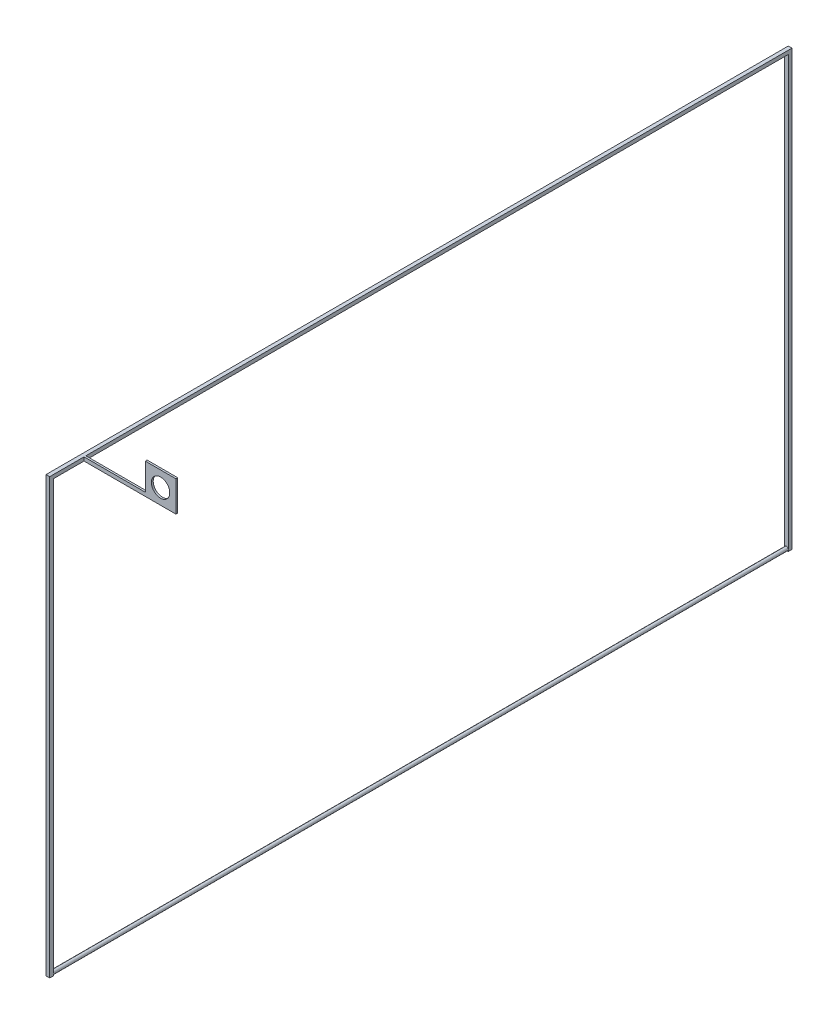
ISO-10303-21;
HEADER;
FILE_DESCRIPTION(('STEP AP214'),'2;1');
FILE_NAME('part.step','',(''),(''),'','','');
FILE_SCHEMA(('AUTOMOTIVE_DESIGN { 1 0 10303 214 1 1 1 1 }'));
ENDSEC;
DATA;
#1=APPLICATION_CONTEXT('core data for automotive mechanical design processes');
#2=APPLICATION_PROTOCOL_DEFINITION('international standard','automotive_design',2000,#1);
#3=PRODUCT_CONTEXT('',#1,'mechanical');
#4=PRODUCT('Part','Part','',(#3));
#5=PRODUCT_RELATED_PRODUCT_CATEGORY('part','',(#4));
#6=PRODUCT_DEFINITION_FORMATION('','',#4);
#7=PRODUCT_DEFINITION_CONTEXT('part definition',#1,'design');
#8=PRODUCT_DEFINITION('design','',#6,#7);
#9=PRODUCT_DEFINITION_SHAPE('','',#8);
#10=(LENGTH_UNIT() NAMED_UNIT(*) SI_UNIT(.MILLI.,.METRE.));
#11=(NAMED_UNIT(*) PLANE_ANGLE_UNIT() SI_UNIT($,.RADIAN.));
#12=(NAMED_UNIT(*) SI_UNIT($,.STERADIAN.) SOLID_ANGLE_UNIT());
#13=UNCERTAINTY_MEASURE_WITH_UNIT(LENGTH_MEASURE(1.E-05),#10,'distance_accuracy_value','');
#14=(GEOMETRIC_REPRESENTATION_CONTEXT(3) GLOBAL_UNCERTAINTY_ASSIGNED_CONTEXT((#13)) GLOBAL_UNIT_ASSIGNED_CONTEXT((#10,
#11,#12)) REPRESENTATION_CONTEXT('',''));
#15=CARTESIAN_POINT('',(0.,0.,0.));
#16=DIRECTION('',(0.,0.,1.));
#17=DIRECTION('',(1.,0.,0.));
#18=AXIS2_PLACEMENT_3D('',#15,#16,#17);
#19=CARTESIAN_POINT('',(1.5,-1.5,0.));
#20=DIRECTION('',(-1.,0.,0.));
#21=DIRECTION('',(0.,0.,1.));
#22=AXIS2_PLACEMENT_3D('',#19,#20,#21);
#23=PLANE('',#22);
#24=DIRECTION('',(0.,1.,0.));
#25=VECTOR('',#24,1.);
#26=CARTESIAN_POINT('',(1.5,196.831928314114,-25.0000000000018));
#27=LINE('',#26,#25);
#28=CARTESIAN_POINT('',(1.5,350.,-25.0000000000032));
#29=VERTEX_POINT('',#28);
#30=CARTESIAN_POINT('',(1.5,353.,-25.0000000000032));
#31=VERTEX_POINT('',#30);
#32=EDGE_CURVE('E52',#29,#31,#27,.T.);
#33=ORIENTED_EDGE('',*,*,#32,.T.);
#34=DIRECTION('',(0.,0.,1.));
#35=VECTOR('',#34,1.);
#36=CARTESIAN_POINT('',(1.5,353.,2.99999999999994));
#37=LINE('',#36,#35);
#38=CARTESIAN_POINT('',(1.5,353.,2.99999999999994));
#39=VERTEX_POINT('',#38);
#40=EDGE_CURVE('E229',#31,#39,#37,.T.);
#41=ORIENTED_EDGE('',*,*,#40,.T.);
#42=DIRECTION('',(0.,-1.,0.));
#43=VECTOR('',#42,1.);
#44=CARTESIAN_POINT('',(1.5,-1.50000000000002,2.99999999999993));
#45=LINE('',#44,#43);
#46=CARTESIAN_POINT('',(1.5,-1.50000000000002,2.99999999999993));
#47=VERTEX_POINT('',#46);
#48=EDGE_CURVE('E231',#39,#47,#45,.T.);
#49=ORIENTED_EDGE('',*,*,#48,.T.);
#50=DIRECTION('',(0.,0.,-1.));
#51=VECTOR('',#50,1.);
#52=CARTESIAN_POINT('',(1.5,-1.5,0.));
#53=LINE('',#52,#51);
#54=CARTESIAN_POINT('',(1.5,-1.5,0.));
#55=VERTEX_POINT('',#54);
#56=EDGE_CURVE('E234',#47,#55,#53,.T.);
#57=ORIENTED_EDGE('',*,*,#56,.T.);
#58=DIRECTION('',(0.,1.,0.));
#59=VECTOR('',#58,1.);
#60=CARTESIAN_POINT('',(1.5,350.,0.));
#61=LINE('',#60,#59);
#62=CARTESIAN_POINT('',(1.5,0.,0.));
#63=VERTEX_POINT('',#62);
#64=EDGE_CURVE('E216',#55,#63,#61,.T.);
#65=ORIENTED_EDGE('',*,*,#64,.T.);
#66=CARTESIAN_POINT('',(1.5,350.,0.));
#67=VERTEX_POINT('',#66);
#68=EDGE_CURVE('E167',#63,#67,#61,.T.);
#69=ORIENTED_EDGE('',*,*,#68,.T.);
#70=DIRECTION('',(0.,0.,-1.));
#71=VECTOR('',#70,1.);
#72=CARTESIAN_POINT('',(1.5,350.,0.));
#73=LINE('',#72,#71);
#74=EDGE_CURVE('E218',#67,#29,#73,.T.);
#75=ORIENTED_EDGE('',*,*,#74,.T.);
#76=EDGE_LOOP('',(#33,#41,#49,#57,#65,#69,#75));
#77=FACE_BOUND('',#76,.T.);
#78=ADVANCED_FACE('F35',(#77),#23,.F.);
#79=CARTESIAN_POINT('',(-1.5,0.,0.));
#80=DIRECTION('',(0.,0.,-1.));
#81=DIRECTION('',(0.,1.,0.));
#82=AXIS2_PLACEMENT_3D('',#79,#80,#81);
#83=PLANE('',#82);
#84=DIRECTION('',(0.,1.,0.));
#85=VECTOR('',#84,1.);
#86=CARTESIAN_POINT('',(-1.5,350.,0.));
#87=LINE('',#86,#85);
#88=CARTESIAN_POINT('',(-1.5,-1.5,0.));
#89=VERTEX_POINT('',#88);
#90=CARTESIAN_POINT('',(-1.5,0.,0.));
#91=VERTEX_POINT('',#90);
#92=EDGE_CURVE('E238',#89,#91,#87,.T.);
#93=ORIENTED_EDGE('',*,*,#92,.T.);
#94=CARTESIAN_POINT('',(0.,0.,0.));
#95=DIRECTION('',(0.,0.,-1.));
#96=DIRECTION('',(-1.,0.,0.));
#97=AXIS2_PLACEMENT_3D('',#94,#95,#96);
#98=CIRCLE('',#97,1.5);
#99=CARTESIAN_POINT('',(0.,-1.5,0.));
#100=VERTEX_POINT('',#99);
#101=EDGE_CURVE('E45',#100,#91,#98,.T.);
#102=ORIENTED_EDGE('',*,*,#101,.F.);
#103=DIRECTION('',(1.,0.,0.));
#104=VECTOR('',#103,1.);
#105=CARTESIAN_POINT('',(-1.5,-1.5,0.));
#106=LINE('',#105,#104);
#107=EDGE_CURVE('E264',#89,#100,#106,.T.);
#108=ORIENTED_EDGE('',*,*,#107,.F.);
#109=EDGE_LOOP('',(#93,#102,#108));
#110=FACE_BOUND('',#109,.T.);
#111=ADVANCED_FACE('F341',(#110),#83,.T.);
#112=EDGE_CURVE('E268',#100,#55,#106,.T.);
#113=ORIENTED_EDGE('',*,*,#112,.F.);
#114=EDGE_CURVE('E44',#63,#100,#98,.T.);
#115=ORIENTED_EDGE('',*,*,#114,.F.);
#116=ORIENTED_EDGE('',*,*,#64,.F.);
#117=EDGE_LOOP('',(#113,#115,#116));
#118=FACE_BOUND('',#117,.T.);
#119=ADVANCED_FACE('F348',(#118),#83,.T.);
#120=CARTESIAN_POINT('',(-1.5,-1.49999999999995,-600.));
#121=DIRECTION('',(0.,0.,1.));
#122=DIRECTION('',(1.,0.,0.));
#123=AXIS2_PLACEMENT_3D('',#120,#121,#122);
#124=PLANE('',#123);
#125=DIRECTION('',(0.,-1.,0.));
#126=VECTOR('',#125,1.);
#127=CARTESIAN_POINT('',(1.5,350.,-600.));
#128=LINE('',#127,#126);
#129=CARTESIAN_POINT('',(1.5,0.,-600.));
#130=VERTEX_POINT('',#129);
#131=CARTESIAN_POINT('',(1.5,-1.49999999999995,-600.));
#132=VERTEX_POINT('',#131);
#133=EDGE_CURVE('E220',#130,#132,#128,.T.);
#134=ORIENTED_EDGE('',*,*,#133,.F.);
#135=CARTESIAN_POINT('',(0.,0.,-600.));
#136=DIRECTION('',(0.,0.,-1.));
#137=DIRECTION('',(-1.,0.,0.));
#138=AXIS2_PLACEMENT_3D('',#135,#136,#137);
#139=CIRCLE('',#138,1.5);
#140=CARTESIAN_POINT('',(0.,-1.49999999999995,-600.));
#141=VERTEX_POINT('',#140);
#142=EDGE_CURVE('E329',#130,#141,#139,.T.);
#143=ORIENTED_EDGE('',*,*,#142,.T.);
#144=DIRECTION('',(1.,0.,0.));
#145=VECTOR('',#144,1.);
#146=CARTESIAN_POINT('',(-1.5,-1.49999999999995,-600.));
#147=LINE('',#146,#145);
#148=EDGE_CURVE('E281',#141,#132,#147,.T.);
#149=ORIENTED_EDGE('',*,*,#148,.T.);
#150=EDGE_LOOP('',(#134,#143,#149));
#151=FACE_BOUND('',#150,.T.);
#152=ADVANCED_FACE('F328',(#151),#124,.T.);
#153=CARTESIAN_POINT('',(-1.5,-1.49999999999995,-600.));
#154=VERTEX_POINT('',#153);
#155=EDGE_CURVE('E278',#154,#141,#147,.T.);
#156=ORIENTED_EDGE('',*,*,#155,.T.);
#157=CARTESIAN_POINT('',(-1.5,0.,-600.));
#158=VERTEX_POINT('',#157);
#159=EDGE_CURVE('E267',#141,#158,#139,.T.);
#160=ORIENTED_EDGE('',*,*,#159,.T.);
#161=DIRECTION('',(0.,-1.,0.));
#162=VECTOR('',#161,1.);
#163=CARTESIAN_POINT('',(-1.5,350.,-600.));
#164=LINE('',#163,#162);
#165=EDGE_CURVE('E244',#158,#154,#164,.T.);
#166=ORIENTED_EDGE('',*,*,#165,.T.);
#167=EDGE_LOOP('',(#156,#160,#166));
#168=FACE_BOUND('',#167,.T.);
#169=ADVANCED_FACE('F332',(#168),#124,.T.);
#170=ORIENTED_EDGE('',*,*,#68,.F.);
#171=EDGE_CURVE('E11',#91,#63,#98,.T.);
#172=ORIENTED_EDGE('',*,*,#171,.F.);
#173=CARTESIAN_POINT('',(-1.5,350.,0.));
#174=VERTEX_POINT('',#173);
#175=EDGE_CURVE('E237',#91,#174,#87,.T.);
#176=ORIENTED_EDGE('',*,*,#175,.T.);
#177=DIRECTION('',(1.,0.,0.));
#178=VECTOR('',#177,1.);
#179=CARTESIAN_POINT('',(-1.5,350.,0.));
#180=LINE('',#179,#178);
#181=EDGE_CURVE('E263',#174,#67,#180,.T.);
#182=ORIENTED_EDGE('',*,*,#181,.T.);
#183=EDGE_LOOP('',(#170,#172,#176,#182));
#184=FACE_BOUND('',#183,.T.);
#185=ADVANCED_FACE('F289',(#184),#83,.T.);
#186=CARTESIAN_POINT('',(-1.5,-1.5,0.));
#187=DIRECTION('',(0.,-1.,0.));
#188=DIRECTION('',(0.,0.,-1.));
#189=AXIS2_PLACEMENT_3D('',#186,#187,#188);
#190=PLANE('',#189);
#191=ORIENTED_EDGE('',*,*,#107,.T.);
#192=ORIENTED_EDGE('',*,*,#112,.T.);
#193=ORIENTED_EDGE('',*,*,#56,.F.);
#194=DIRECTION('',(1.,0.,0.));
#195=VECTOR('',#194,1.);
#196=CARTESIAN_POINT('',(-1.5,-1.50000000000002,2.99999999999993));
#197=LINE('',#196,#195);
#198=CARTESIAN_POINT('',(-1.5,-1.50000000000002,2.99999999999993));
#199=VERTEX_POINT('',#198);
#200=EDGE_CURVE('E269',#199,#47,#197,.T.);
#201=ORIENTED_EDGE('',*,*,#200,.F.);
#202=DIRECTION('',(0.,0.,-1.));
#203=VECTOR('',#202,1.);
#204=CARTESIAN_POINT('',(-1.5,-1.5,0.));
#205=LINE('',#204,#203);
#206=EDGE_CURVE('E260',#199,#89,#205,.T.);
#207=ORIENTED_EDGE('',*,*,#206,.T.);
#208=EDGE_LOOP('',(#191,#192,#193,#201,#207));
#209=FACE_BOUND('',#208,.T.);
#210=ADVANCED_FACE('F351',(#209),#190,.T.);
#211=CARTESIAN_POINT('',(-1.5,-1.50000000000002,2.99999999999993));
#212=DIRECTION('',(0.,0.,1.));
#213=DIRECTION('',(0.,-1.,0.));
#214=AXIS2_PLACEMENT_3D('',#211,#212,#213);
#215=PLANE('',#214);
#216=ORIENTED_EDGE('',*,*,#200,.T.);
#217=ORIENTED_EDGE('',*,*,#48,.F.);
#218=DIRECTION('',(1.,0.,0.));
#219=VECTOR('',#218,1.);
#220=CARTESIAN_POINT('',(-1.5,353.,2.99999999999994));
#221=LINE('',#220,#219);
#222=CARTESIAN_POINT('',(-1.5,353.,2.99999999999994));
#223=VERTEX_POINT('',#222);
#224=EDGE_CURVE('E271',#223,#39,#221,.T.);
#225=ORIENTED_EDGE('',*,*,#224,.F.);
#226=DIRECTION('',(0.,-1.,0.));
#227=VECTOR('',#226,1.);
#228=CARTESIAN_POINT('',(-1.5,-1.50000000000002,2.99999999999993));
#229=LINE('',#228,#227);
#230=EDGE_CURVE('E257',#223,#199,#229,.T.);
#231=ORIENTED_EDGE('',*,*,#230,.T.);
#232=EDGE_LOOP('',(#216,#217,#225,#231));
#233=FACE_BOUND('',#232,.T.);
#234=ADVANCED_FACE('F353',(#233),#215,.T.);
#235=CARTESIAN_POINT('',(-1.5,353.,2.99999999999994));
#236=DIRECTION('',(0.,1.,0.));
#237=DIRECTION('',(0.,0.,1.));
#238=AXIS2_PLACEMENT_3D('',#235,#236,#237);
#239=PLANE('',#238);
#240=ORIENTED_EDGE('',*,*,#224,.T.);
#241=ORIENTED_EDGE('',*,*,#40,.F.);
#242=DIRECTION('',(1.,0.,0.));
#243=VECTOR('',#242,1.);
#244=CARTESIAN_POINT('',(-303.369413495186,353.,-25.0000000000033));
#245=LINE('',#244,#243);
#246=CARTESIAN_POINT('',(51.5,353.,-25.0000000000033));
#247=VERTEX_POINT('',#246);
#248=EDGE_CURVE('E201',#31,#247,#245,.T.);
#249=ORIENTED_EDGE('',*,*,#248,.T.);
#250=DIRECTION('',(0.,0.,1.));
#251=VECTOR('',#250,1.);
#252=CARTESIAN_POINT('',(51.5,353.,-26.5000000000033));
#253=LINE('',#252,#251);
#254=CARTESIAN_POINT('',(51.5,353.,-26.5000000000033));
#255=VERTEX_POINT('',#254);
#256=EDGE_CURVE('E168',#255,#247,#253,.T.);
#257=ORIENTED_EDGE('',*,*,#256,.F.);
#258=DIRECTION('',(1.,0.,0.));
#259=VECTOR('',#258,1.);
#260=CARTESIAN_POINT('',(-303.369413495186,353.,-26.5000000000033));
#261=LINE('',#260,#259);
#262=CARTESIAN_POINT('',(1.5,353.,-26.5000000000033));
#263=VERTEX_POINT('',#262);
#264=EDGE_CURVE('E186',#263,#255,#261,.T.);
#265=ORIENTED_EDGE('',*,*,#264,.F.);
#266=CARTESIAN_POINT('',(1.5,353.,-603.));
#267=VERTEX_POINT('',#266);
#268=EDGE_CURVE('E60',#267,#263,#37,.T.);
#269=ORIENTED_EDGE('',*,*,#268,.F.);
#270=DIRECTION('',(1.,0.,0.));
#271=VECTOR('',#270,1.);
#272=CARTESIAN_POINT('',(-1.5,353.,-603.));
#273=LINE('',#272,#271);
#274=CARTESIAN_POINT('',(-1.5,353.,-603.));
#275=VERTEX_POINT('',#274);
#276=EDGE_CURVE('E274',#275,#267,#273,.T.);
#277=ORIENTED_EDGE('',*,*,#276,.F.);
#278=DIRECTION('',(0.,0.,1.));
#279=VECTOR('',#278,1.);
#280=CARTESIAN_POINT('',(-1.5,353.,2.99999999999994));
#281=LINE('',#280,#279);
#282=EDGE_CURVE('E254',#275,#223,#281,.T.);
#283=ORIENTED_EDGE('',*,*,#282,.T.);
#284=EDGE_LOOP('',(#240,#241,#249,#257,#265,#269,#277,#283));
#285=FACE_BOUND('',#284,.T.);
#286=ADVANCED_FACE('F301',(#285),#239,.T.);
#287=CARTESIAN_POINT('',(-1.5,353.,-603.));
#288=DIRECTION('',(0.,0.,-1.));
#289=DIRECTION('',(0.,1.,0.));
#290=AXIS2_PLACEMENT_3D('',#287,#288,#289);
#291=PLANE('',#290);
#292=ORIENTED_EDGE('',*,*,#276,.T.);
#293=DIRECTION('',(0.,1.,0.));
#294=VECTOR('',#293,1.);
#295=CARTESIAN_POINT('',(1.5,353.,-603.));
#296=LINE('',#295,#294);
#297=CARTESIAN_POINT('',(1.5,-1.49999999999995,-603.));
#298=VERTEX_POINT('',#297);
#299=EDGE_CURVE('E227',#298,#267,#296,.T.);
#300=ORIENTED_EDGE('',*,*,#299,.F.);
#301=DIRECTION('',(1.,0.,0.));
#302=VECTOR('',#301,1.);
#303=CARTESIAN_POINT('',(-1.5,-1.49999999999995,-603.));
#304=LINE('',#303,#302);
#305=CARTESIAN_POINT('',(-1.5,-1.49999999999995,-603.));
#306=VERTEX_POINT('',#305);
#307=EDGE_CURVE('E276',#306,#298,#304,.T.);
#308=ORIENTED_EDGE('',*,*,#307,.F.);
#309=DIRECTION('',(0.,1.,0.));
#310=VECTOR('',#309,1.);
#311=CARTESIAN_POINT('',(-1.5,353.,-603.));
#312=LINE('',#311,#310);
#313=EDGE_CURVE('E251',#306,#275,#312,.T.);
#314=ORIENTED_EDGE('',*,*,#313,.T.);
#315=EDGE_LOOP('',(#292,#300,#308,#314));
#316=FACE_BOUND('',#315,.T.);
#317=ADVANCED_FACE('F316',(#316),#291,.T.);
#318=CARTESIAN_POINT('',(-1.5,-1.49999999999995,-603.));
#319=DIRECTION('',(0.,-1.,0.));
#320=DIRECTION('',(0.,0.,-1.));
#321=AXIS2_PLACEMENT_3D('',#318,#319,#320);
#322=PLANE('',#321);
#323=ORIENTED_EDGE('',*,*,#307,.T.);
#324=DIRECTION('',(0.,0.,-1.));
#325=VECTOR('',#324,1.);
#326=CARTESIAN_POINT('',(1.5,-1.49999999999995,-603.));
#327=LINE('',#326,#325);
#328=EDGE_CURVE('E224',#132,#298,#327,.T.);
#329=ORIENTED_EDGE('',*,*,#328,.F.);
#330=ORIENTED_EDGE('',*,*,#148,.F.);
#331=ORIENTED_EDGE('',*,*,#155,.F.);
#332=DIRECTION('',(0.,0.,-1.));
#333=VECTOR('',#332,1.);
#334=CARTESIAN_POINT('',(-1.5,-1.49999999999995,-603.));
#335=LINE('',#334,#333);
#336=EDGE_CURVE('E248',#154,#306,#335,.T.);
#337=ORIENTED_EDGE('',*,*,#336,.T.);
#338=EDGE_LOOP('',(#323,#329,#330,#331,#337));
#339=FACE_BOUND('',#338,.T.);
#340=ADVANCED_FACE('F319',(#339),#322,.T.);
#341=CARTESIAN_POINT('',(-1.5,350.,-600.));
#342=VERTEX_POINT('',#341);
#343=EDGE_CURVE('E245',#342,#158,#164,.T.);
#344=ORIENTED_EDGE('',*,*,#343,.T.);
#345=EDGE_CURVE('E39',#158,#130,#139,.T.);
#346=ORIENTED_EDGE('',*,*,#345,.T.);
#347=CARTESIAN_POINT('',(1.5,350.,-600.));
#348=VERTEX_POINT('',#347);
#349=EDGE_CURVE('E221',#348,#130,#128,.T.);
#350=ORIENTED_EDGE('',*,*,#349,.F.);
#351=DIRECTION('',(1.,0.,0.));
#352=VECTOR('',#351,1.);
#353=CARTESIAN_POINT('',(-1.5,350.,-600.));
#354=LINE('',#353,#352);
#355=EDGE_CURVE('E282',#342,#348,#354,.T.);
#356=ORIENTED_EDGE('',*,*,#355,.F.);
#357=EDGE_LOOP('',(#344,#346,#350,#356));
#358=FACE_BOUND('',#357,.T.);
#359=ADVANCED_FACE('F337',(#358),#124,.T.);
#360=CARTESIAN_POINT('',(-1.5,350.,0.));
#361=DIRECTION('',(0.,-1.,0.));
#362=DIRECTION('',(0.,0.,-1.));
#363=AXIS2_PLACEMENT_3D('',#360,#361,#362);
#364=PLANE('',#363);
#365=ORIENTED_EDGE('',*,*,#355,.T.);
#366=CARTESIAN_POINT('',(1.5,350.,-26.5000000000033));
#367=VERTEX_POINT('',#366);
#368=EDGE_CURVE('E183',#367,#348,#73,.T.);
#369=ORIENTED_EDGE('',*,*,#368,.F.);
#370=DIRECTION('',(1.,0.,0.));
#371=VECTOR('',#370,1.);
#372=CARTESIAN_POINT('',(-303.369413495186,350.,-26.5000000000032));
#373=LINE('',#372,#371);
#374=CARTESIAN_POINT('',(76.4999999999999,350.,-26.5000000000032));
#375=VERTEX_POINT('',#374);
#376=EDGE_CURVE('E174',#367,#375,#373,.T.);
#377=ORIENTED_EDGE('',*,*,#376,.T.);
#378=DIRECTION('',(0.,0.,1.));
#379=VECTOR('',#378,1.);
#380=CARTESIAN_POINT('',(76.4999999999999,350.,-26.5000000000032));
#381=LINE('',#380,#379);
#382=CARTESIAN_POINT('',(76.4999999999999,350.,-25.0000000000032));
#383=VERTEX_POINT('',#382);
#384=EDGE_CURVE('E157',#375,#383,#381,.T.);
#385=ORIENTED_EDGE('',*,*,#384,.T.);
#386=DIRECTION('',(1.,0.,0.));
#387=VECTOR('',#386,1.);
#388=CARTESIAN_POINT('',(-303.369413495186,350.,-25.0000000000032));
#389=LINE('',#388,#387);
#390=EDGE_CURVE('E198',#29,#383,#389,.T.);
#391=ORIENTED_EDGE('',*,*,#390,.F.);
#392=ORIENTED_EDGE('',*,*,#74,.F.);
#393=ORIENTED_EDGE('',*,*,#181,.F.);
#394=DIRECTION('',(0.,0.,-1.));
#395=VECTOR('',#394,1.);
#396=CARTESIAN_POINT('',(-1.5,350.,0.));
#397=LINE('',#396,#395);
#398=EDGE_CURVE('E241',#174,#342,#397,.T.);
#399=ORIENTED_EDGE('',*,*,#398,.T.);
#400=EDGE_LOOP('',(#365,#369,#377,#385,#391,#392,#393,#399));
#401=FACE_BOUND('',#400,.T.);
#402=ADVANCED_FACE('F182',(#401),#364,.T.);
#403=CARTESIAN_POINT('',(-1.5,-1.5,0.));
#404=DIRECTION('',(-1.,0.,0.));
#405=DIRECTION('',(0.,0.,1.));
#406=AXIS2_PLACEMENT_3D('',#403,#404,#405);
#407=PLANE('',#406);
#408=ORIENTED_EDGE('',*,*,#92,.F.);
#409=ORIENTED_EDGE('',*,*,#206,.F.);
#410=ORIENTED_EDGE('',*,*,#230,.F.);
#411=ORIENTED_EDGE('',*,*,#282,.F.);
#412=ORIENTED_EDGE('',*,*,#313,.F.);
#413=ORIENTED_EDGE('',*,*,#336,.F.);
#414=ORIENTED_EDGE('',*,*,#165,.F.);
#415=ORIENTED_EDGE('',*,*,#343,.F.);
#416=ORIENTED_EDGE('',*,*,#398,.F.);
#417=ORIENTED_EDGE('',*,*,#175,.F.);
#418=EDGE_LOOP('',(#408,#409,#410,#411,#412,#413,#414,#415,#416,#417));
#419=FACE_BOUND('',#418,.T.);
#420=ADVANCED_FACE('F313',(#419),#407,.T.);
#421=ORIENTED_EDGE('',*,*,#268,.T.);
#422=DIRECTION('',(0.,1.,0.));
#423=VECTOR('',#422,1.);
#424=CARTESIAN_POINT('',(1.5,196.831928314114,-26.5000000000018));
#425=LINE('',#424,#423);
#426=EDGE_CURVE('E184',#367,#263,#425,.T.);
#427=ORIENTED_EDGE('',*,*,#426,.F.);
#428=ORIENTED_EDGE('',*,*,#368,.T.);
#429=ORIENTED_EDGE('',*,*,#349,.T.);
#430=ORIENTED_EDGE('',*,*,#133,.T.);
#431=ORIENTED_EDGE('',*,*,#328,.T.);
#432=ORIENTED_EDGE('',*,*,#299,.T.);
#433=EDGE_LOOP('',(#421,#427,#428,#429,#430,#431,#432));
#434=FACE_BOUND('',#433,.T.);
#435=ADVANCED_FACE('F323',(#434),#23,.F.);
#436=CARTESIAN_POINT('',(0.,0.,0.));
#437=DIRECTION('',(0.,0.,-1.));
#438=DIRECTION('',(-1.,0.,0.));
#439=AXIS2_PLACEMENT_3D('',#436,#437,#438);
#440=CYLINDRICAL_SURFACE('',#439,1.5);
#441=ORIENTED_EDGE('',*,*,#171,.T.);
#442=ORIENTED_EDGE('',*,*,#114,.T.);
#443=ORIENTED_EDGE('',*,*,#101,.T.);
#444=EDGE_LOOP('',(#441,#442,#443));
#445=FACE_BOUND('',#444,.T.);
#446=ORIENTED_EDGE('',*,*,#345,.F.);
#447=ORIENTED_EDGE('',*,*,#159,.F.);
#448=ORIENTED_EDGE('',*,*,#142,.F.);
#449=EDGE_LOOP('',(#446,#447,#448));
#450=FACE_BOUND('',#449,.T.);
#451=ADVANCED_FACE('F37',(#445,#450),#440,.T.);
#452=CARTESIAN_POINT('',(76.4999999999999,196.831928314114,-26.5000000000018));
#453=DIRECTION('',(1.,0.,0.));
#454=DIRECTION('',(0.,1.,0.));
#455=AXIS2_PLACEMENT_3D('',#452,#453,#454);
#456=PLANE('',#455);
#457=DIRECTION('',(0.,1.,0.));
#458=VECTOR('',#457,1.);
#459=CARTESIAN_POINT('',(76.4999999999999,196.831928314114,-25.0000000000018));
#460=LINE('',#459,#458);
#461=CARTESIAN_POINT('',(76.5000000000001,375.,-25.0000000000035));
#462=VERTEX_POINT('',#461);
#463=EDGE_CURVE('E162',#383,#462,#460,.T.);
#464=ORIENTED_EDGE('',*,*,#463,.F.);
#465=ORIENTED_EDGE('',*,*,#384,.F.);
#466=DIRECTION('',(0.,1.,0.));
#467=VECTOR('',#466,1.);
#468=CARTESIAN_POINT('',(76.4999999999999,196.831928314114,-26.5000000000018));
#469=LINE('',#468,#467);
#470=CARTESIAN_POINT('',(76.5000000000001,375.,-26.5000000000035));
#471=VERTEX_POINT('',#470);
#472=EDGE_CURVE('E160',#375,#471,#469,.T.);
#473=ORIENTED_EDGE('',*,*,#472,.T.);
#474=DIRECTION('',(0.,0.,1.));
#475=VECTOR('',#474,1.);
#476=CARTESIAN_POINT('',(76.5000000000001,375.,-26.5000000000035));
#477=LINE('',#476,#475);
#478=EDGE_CURVE('E196',#471,#462,#477,.T.);
#479=ORIENTED_EDGE('',*,*,#478,.T.);
#480=EDGE_LOOP('',(#464,#465,#473,#479));
#481=FACE_BOUND('',#480,.T.);
#482=ADVANCED_FACE('F159',(#481),#456,.T.);
#483=CARTESIAN_POINT('',(51.5,196.831928314114,-26.5000000000018));
#484=DIRECTION('',(1.,0.,0.));
#485=DIRECTION('',(0.,0.,-1.));
#486=AXIS2_PLACEMENT_3D('',#483,#484,#485);
#487=PLANE('',#486);
#488=DIRECTION('',(0.,1.,0.));
#489=VECTOR('',#488,1.);
#490=CARTESIAN_POINT('',(51.5,196.831928314114,-25.0000000000018));
#491=LINE('',#490,#489);
#492=CARTESIAN_POINT('',(51.5,375.,-25.0000000000035));
#493=VERTEX_POINT('',#492);
#494=EDGE_CURVE('E203',#247,#493,#491,.T.);
#495=ORIENTED_EDGE('',*,*,#494,.T.);
#496=DIRECTION('',(0.,0.,1.));
#497=VECTOR('',#496,1.);
#498=CARTESIAN_POINT('',(51.5,375.,-26.5000000000035));
#499=LINE('',#498,#497);
#500=CARTESIAN_POINT('',(51.5,375.,-26.5000000000035));
#501=VERTEX_POINT('',#500);
#502=EDGE_CURVE('E211',#501,#493,#499,.T.);
#503=ORIENTED_EDGE('',*,*,#502,.F.);
#504=DIRECTION('',(0.,1.,0.));
#505=VECTOR('',#504,1.);
#506=CARTESIAN_POINT('',(51.5,196.831928314114,-26.5000000000018));
#507=LINE('',#506,#505);
#508=EDGE_CURVE('E190',#255,#501,#507,.T.);
#509=ORIENTED_EDGE('',*,*,#508,.F.);
#510=ORIENTED_EDGE('',*,*,#256,.T.);
#511=EDGE_LOOP('',(#495,#503,#509,#510));
#512=FACE_BOUND('',#511,.T.);
#513=ADVANCED_FACE('F305',(#512),#487,.F.);
#514=CARTESIAN_POINT('',(-303.369413495186,375.,-26.5000000000035));
#515=DIRECTION('',(0.,-1.,0.));
#516=DIRECTION('',(0.,0.,-1.));
#517=AXIS2_PLACEMENT_3D('',#514,#515,#516);
#518=PLANE('',#517);
#519=DIRECTION('',(1.,0.,0.));
#520=VECTOR('',#519,1.);
#521=CARTESIAN_POINT('',(-303.369413495186,375.,-25.0000000000035));
#522=LINE('',#521,#520);
#523=EDGE_CURVE('E205',#493,#462,#522,.T.);
#524=ORIENTED_EDGE('',*,*,#523,.T.);
#525=ORIENTED_EDGE('',*,*,#478,.F.);
#526=DIRECTION('',(1.,0.,0.));
#527=VECTOR('',#526,1.);
#528=CARTESIAN_POINT('',(-303.369413495186,375.,-26.5000000000035));
#529=LINE('',#528,#527);
#530=EDGE_CURVE('E176',#501,#471,#529,.T.);
#531=ORIENTED_EDGE('',*,*,#530,.F.);
#532=ORIENTED_EDGE('',*,*,#502,.T.);
#533=EDGE_LOOP('',(#524,#525,#531,#532));
#534=FACE_BOUND('',#533,.T.);
#535=ADVANCED_FACE('F438',(#534),#518,.F.);
#536=CARTESIAN_POINT('',(64.,362.5,-26.5000000000034));
#537=DIRECTION('',(0.,0.,1.));
#538=DIRECTION('',(0.,-1.,0.));
#539=AXIS2_PLACEMENT_3D('',#536,#537,#538);
#540=CYLINDRICAL_SURFACE('',#539,7.49999999999999);
#541=CARTESIAN_POINT('',(64.,362.5,-26.5000000000034));
#542=DIRECTION('',(0.,0.,-1.));
#543=DIRECTION('',(0.,1.,0.));
#544=AXIS2_PLACEMENT_3D('',#541,#542,#543);
#545=CIRCLE('',#544,7.49999999999999);
#546=CARTESIAN_POINT('',(64.,370.,-26.5000000000034));
#547=VERTEX_POINT('',#546);
#548=EDGE_CURVE('E193',#547,#547,#545,.T.);
#549=ORIENTED_EDGE('',*,*,#548,.T.);
#550=EDGE_LOOP('',(#549));
#551=FACE_BOUND('',#550,.T.);
#552=CARTESIAN_POINT('',(64.,362.5,-25.0000000000034));
#553=DIRECTION('',(0.,0.,-1.));
#554=DIRECTION('',(0.,1.,0.));
#555=AXIS2_PLACEMENT_3D('',#552,#553,#554);
#556=CIRCLE('',#555,7.49999999999999);
#557=CARTESIAN_POINT('',(64.,370.,-25.0000000000034));
#558=VERTEX_POINT('',#557);
#559=EDGE_CURVE('E178',#558,#558,#556,.T.);
#560=ORIENTED_EDGE('',*,*,#559,.F.);
#561=EDGE_LOOP('',(#560));
#562=FACE_BOUND('',#561,.T.);
#563=ADVANCED_FACE('F447',(#551,#562),#540,.F.);
#564=CARTESIAN_POINT('',(-303.369413495186,196.831928314114,-26.5000000000018));
#565=DIRECTION('',(0.,0.,-1.));
#566=DIRECTION('',(0.,1.,0.));
#567=AXIS2_PLACEMENT_3D('',#564,#565,#566);
#568=PLANE('',#567);
#569=ORIENTED_EDGE('',*,*,#472,.F.);
#570=ORIENTED_EDGE('',*,*,#376,.F.);
#571=ORIENTED_EDGE('',*,*,#426,.T.);
#572=ORIENTED_EDGE('',*,*,#264,.T.);
#573=ORIENTED_EDGE('',*,*,#508,.T.);
#574=ORIENTED_EDGE('',*,*,#530,.T.);
#575=EDGE_LOOP('',(#569,#570,#571,#572,#573,#574));
#576=FACE_BOUND('',#575,.T.);
#577=ORIENTED_EDGE('',*,*,#548,.F.);
#578=EDGE_LOOP('',(#577));
#579=FACE_BOUND('',#578,.T.);
#580=ADVANCED_FACE('F172',(#576,#579),#568,.T.);
#581=CARTESIAN_POINT('',(-303.369413495186,196.831928314114,-25.0000000000018));
#582=DIRECTION('',(0.,0.,-1.));
#583=DIRECTION('',(0.,1.,0.));
#584=AXIS2_PLACEMENT_3D('',#581,#582,#583);
#585=PLANE('',#584);
#586=ORIENTED_EDGE('',*,*,#463,.T.);
#587=ORIENTED_EDGE('',*,*,#523,.F.);
#588=ORIENTED_EDGE('',*,*,#494,.F.);
#589=ORIENTED_EDGE('',*,*,#248,.F.);
#590=ORIENTED_EDGE('',*,*,#32,.F.);
#591=ORIENTED_EDGE('',*,*,#390,.T.);
#592=EDGE_LOOP('',(#586,#587,#588,#589,#590,#591));
#593=FACE_BOUND('',#592,.T.);
#594=ORIENTED_EDGE('',*,*,#559,.T.);
#595=EDGE_LOOP('',(#594));
#596=FACE_BOUND('',#595,.T.);
#597=ADVANCED_FACE('F295',(#593,#596),#585,.F.);
#598=CLOSED_SHELL('',(#78,#111,#119,#152,#169,#185,#210,#234,#286,#317,#340,#359,#402,#420,#435,
#451,#482,#513,#535,#563,#580,#597));
#599=MANIFOLD_SOLID_BREP('B2',#598);
#600=ADVANCED_BREP_SHAPE_REPRESENTATION('',(#18,#599),#14);
#601=SHAPE_DEFINITION_REPRESENTATION(#9,#600);
ENDSEC;
END-ISO-10303-21;
